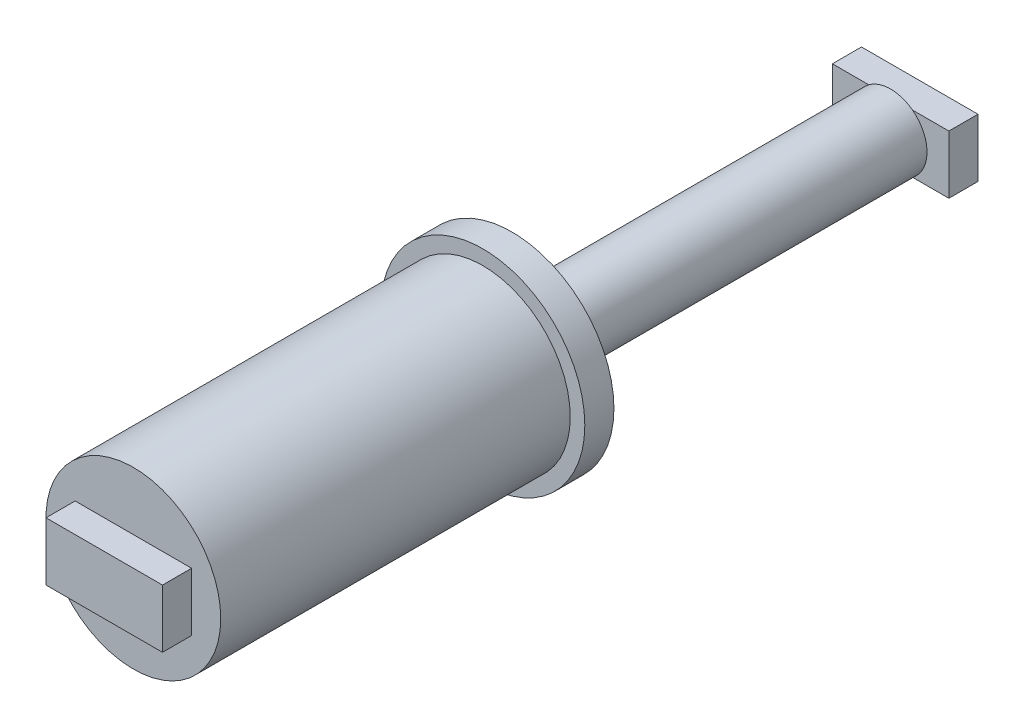
ISO-10303-21;
HEADER;
FILE_DESCRIPTION(('STEP AP214'),'2;1');
FILE_NAME('part.step','',(''),(''),'','','');
FILE_SCHEMA(('AUTOMOTIVE_DESIGN { 1 0 10303 214 1 1 1 1 }'));
ENDSEC;
DATA;
#1=APPLICATION_CONTEXT('core data for automotive mechanical design processes');
#2=APPLICATION_PROTOCOL_DEFINITION('international standard','automotive_design',2000,#1);
#3=PRODUCT_CONTEXT('',#1,'mechanical');
#4=PRODUCT('Part','Part','',(#3));
#5=PRODUCT_RELATED_PRODUCT_CATEGORY('part','',(#4));
#6=PRODUCT_DEFINITION_FORMATION('','',#4);
#7=PRODUCT_DEFINITION_CONTEXT('part definition',#1,'design');
#8=PRODUCT_DEFINITION('design','',#6,#7);
#9=PRODUCT_DEFINITION_SHAPE('','',#8);
#10=(LENGTH_UNIT() NAMED_UNIT(*) SI_UNIT(.MILLI.,.METRE.));
#11=(NAMED_UNIT(*) PLANE_ANGLE_UNIT() SI_UNIT($,.RADIAN.));
#12=(NAMED_UNIT(*) SI_UNIT($,.STERADIAN.) SOLID_ANGLE_UNIT());
#13=UNCERTAINTY_MEASURE_WITH_UNIT(LENGTH_MEASURE(1.E-05),#10,'distance_accuracy_value','');
#14=(GEOMETRIC_REPRESENTATION_CONTEXT(3) GLOBAL_UNCERTAINTY_ASSIGNED_CONTEXT((#13)) GLOBAL_UNIT_ASSIGNED_CONTEXT((#10,
#11,#12)) REPRESENTATION_CONTEXT('',''));
#15=CARTESIAN_POINT('',(0.,0.,0.));
#16=DIRECTION('',(0.,0.,1.));
#17=DIRECTION('',(1.,0.,0.));
#18=AXIS2_PLACEMENT_3D('',#15,#16,#17);
#19=CARTESIAN_POINT('',(0.,0.,0.));
#20=DIRECTION('',(0.,0.,1.));
#21=DIRECTION('',(1.,0.,0.));
#22=AXIS2_PLACEMENT_3D('',#19,#20,#21);
#23=PLANE('',#22);
#24=DIRECTION('',(1.,0.,0.));
#25=VECTOR('',#24,1.);
#26=CARTESIAN_POINT('',(-20.,10.,0.));
#27=LINE('',#26,#25);
#28=CARTESIAN_POINT('',(-7.5,10.,0.));
#29=VERTEX_POINT('',#28);
#30=CARTESIAN_POINT('',(7.5,10.,0.));
#31=VERTEX_POINT('',#30);
#32=EDGE_CURVE('E11',#29,#31,#27,.T.);
#33=ORIENTED_EDGE('',*,*,#32,.F.);
#34=CARTESIAN_POINT('',(0.,0.,0.));
#35=DIRECTION('',(0.,0.,1.));
#36=DIRECTION('',(1.,0.,0.));
#37=AXIS2_PLACEMENT_3D('',#34,#35,#36);
#38=CIRCLE('',#37,12.5);
#39=EDGE_CURVE('E37',#31,#29,#38,.T.);
#40=ORIENTED_EDGE('',*,*,#39,.F.);
#41=EDGE_LOOP('',(#33,#40));
#42=FACE_BOUND('',#41,.T.);
#43=ADVANCED_FACE('F33',(#42),#23,.F.);
#44=DIRECTION('',(-1.,0.,0.));
#45=VECTOR('',#44,1.);
#46=CARTESIAN_POINT('',(-20.,-10.,0.));
#47=LINE('',#46,#45);
#48=CARTESIAN_POINT('',(7.5,-10.,0.));
#49=VERTEX_POINT('',#48);
#50=CARTESIAN_POINT('',(-7.5,-10.,0.));
#51=VERTEX_POINT('',#50);
#52=EDGE_CURVE('E42',#49,#51,#47,.T.);
#53=ORIENTED_EDGE('',*,*,#52,.F.);
#54=EDGE_CURVE('E192',#51,#49,#38,.T.);
#55=ORIENTED_EDGE('',*,*,#54,.F.);
#56=EDGE_LOOP('',(#53,#55));
#57=FACE_BOUND('',#56,.T.);
#58=ADVANCED_FACE('F216',(#57),#23,.F.);
#59=CARTESIAN_POINT('',(0.,0.,140.));
#60=DIRECTION('',(0.,0.,1.));
#61=DIRECTION('',(1.,0.,0.));
#62=AXIS2_PLACEMENT_3D('',#59,#60,#61);
#63=PLANE('',#62);
#64=CARTESIAN_POINT('',(0.,0.,140.));
#65=DIRECTION('',(0.,0.,1.));
#66=DIRECTION('',(1.,0.,0.));
#67=AXIS2_PLACEMENT_3D('',#64,#65,#66);
#68=CIRCLE('',#67,35.);
#69=CARTESIAN_POINT('',(35.,0.,140.));
#70=VERTEX_POINT('',#69);
#71=EDGE_CURVE('E177',#70,#70,#68,.T.);
#72=ORIENTED_EDGE('',*,*,#71,.T.);
#73=EDGE_LOOP('',(#72));
#74=FACE_BOUND('',#73,.T.);
#75=CARTESIAN_POINT('',(0.,0.,140.));
#76=DIRECTION('',(0.,0.,1.));
#77=DIRECTION('',(1.,0.,0.));
#78=AXIS2_PLACEMENT_3D('',#75,#76,#77);
#79=CIRCLE('',#78,30.);
#80=CARTESIAN_POINT('',(30.,0.,140.));
#81=VERTEX_POINT('',#80);
#82=EDGE_CURVE('E170',#81,#81,#79,.T.);
#83=ORIENTED_EDGE('',*,*,#82,.F.);
#84=EDGE_LOOP('',(#83));
#85=FACE_BOUND('',#84,.T.);
#86=ADVANCED_FACE('F220',(#74,#85),#63,.T.);
#87=CARTESIAN_POINT('',(0.,0.,130.));
#88=DIRECTION('',(0.,0.,-1.));
#89=DIRECTION('',(-1.,0.,0.));
#90=AXIS2_PLACEMENT_3D('',#87,#88,#89);
#91=CYLINDRICAL_SURFACE('',#90,12.5);
#92=CARTESIAN_POINT('',(0.,0.,130.));
#93=DIRECTION('',(0.,0.,1.));
#94=DIRECTION('',(1.,0.,0.));
#95=AXIS2_PLACEMENT_3D('',#92,#93,#94);
#96=CIRCLE('',#95,12.5);
#97=CARTESIAN_POINT('',(12.5,0.,130.));
#98=VERTEX_POINT('',#97);
#99=EDGE_CURVE('E182',#98,#98,#96,.T.);
#100=ORIENTED_EDGE('',*,*,#99,.F.);
#101=EDGE_LOOP('',(#100));
#102=FACE_BOUND('',#101,.T.);
#103=ORIENTED_EDGE('',*,*,#39,.T.);
#104=EDGE_CURVE('E188',#29,#51,#38,.T.);
#105=ORIENTED_EDGE('',*,*,#104,.T.);
#106=ORIENTED_EDGE('',*,*,#54,.T.);
#107=EDGE_CURVE('E180',#49,#31,#38,.T.);
#108=ORIENTED_EDGE('',*,*,#107,.T.);
#109=EDGE_LOOP('',(#103,#105,#106,#108));
#110=FACE_BOUND('',#109,.T.);
#111=ADVANCED_FACE('F35',(#102,#110),#91,.T.);
#112=CARTESIAN_POINT('',(0.,0.,130.));
#113=DIRECTION('',(0.,0.,1.));
#114=DIRECTION('',(1.,0.,0.));
#115=AXIS2_PLACEMENT_3D('',#112,#113,#114);
#116=PLANE('',#115);
#117=CARTESIAN_POINT('',(0.,0.,130.));
#118=DIRECTION('',(0.,0.,1.));
#119=DIRECTION('',(1.,0.,0.));
#120=AXIS2_PLACEMENT_3D('',#117,#118,#119);
#121=CIRCLE('',#120,35.);
#122=CARTESIAN_POINT('',(35.,0.,130.));
#123=VERTEX_POINT('',#122);
#124=EDGE_CURVE('E174',#123,#123,#121,.T.);
#125=ORIENTED_EDGE('',*,*,#124,.F.);
#126=EDGE_LOOP('',(#125));
#127=FACE_BOUND('',#126,.T.);
#128=ORIENTED_EDGE('',*,*,#99,.T.);
#129=EDGE_LOOP('',(#128));
#130=FACE_BOUND('',#129,.T.);
#131=ADVANCED_FACE('F226',(#127,#130),#116,.F.);
#132=CARTESIAN_POINT('',(0.,0.,140.));
#133=DIRECTION('',(0.,0.,-1.));
#134=DIRECTION('',(-1.,0.,0.));
#135=AXIS2_PLACEMENT_3D('',#132,#133,#134);
#136=CYLINDRICAL_SURFACE('',#135,35.);
#137=ORIENTED_EDGE('',*,*,#71,.F.);
#138=EDGE_LOOP('',(#137));
#139=FACE_BOUND('',#138,.T.);
#140=ORIENTED_EDGE('',*,*,#124,.T.);
#141=EDGE_LOOP('',(#140));
#142=FACE_BOUND('',#141,.T.);
#143=ADVANCED_FACE('F222',(#139,#142),#136,.T.);
#144=CARTESIAN_POINT('',(0.,0.,260.));
#145=DIRECTION('',(0.,0.,-1.));
#146=DIRECTION('',(-1.,0.,0.));
#147=AXIS2_PLACEMENT_3D('',#144,#145,#146);
#148=CYLINDRICAL_SURFACE('',#147,30.);
#149=CARTESIAN_POINT('',(0.,0.,260.));
#150=DIRECTION('',(0.,0.,1.));
#151=DIRECTION('',(1.,0.,0.));
#152=AXIS2_PLACEMENT_3D('',#149,#150,#151);
#153=CIRCLE('',#152,30.);
#154=CARTESIAN_POINT('',(30.,0.,260.));
#155=VERTEX_POINT('',#154);
#156=EDGE_CURVE('E171',#155,#155,#153,.T.);
#157=ORIENTED_EDGE('',*,*,#156,.F.);
#158=EDGE_LOOP('',(#157));
#159=FACE_BOUND('',#158,.T.);
#160=ORIENTED_EDGE('',*,*,#82,.T.);
#161=EDGE_LOOP('',(#160));
#162=FACE_BOUND('',#161,.T.);
#163=ADVANCED_FACE('F225',(#159,#162),#148,.T.);
#164=CARTESIAN_POINT('',(0.,0.,260.));
#165=DIRECTION('',(0.,0.,1.));
#166=DIRECTION('',(1.,0.,0.));
#167=AXIS2_PLACEMENT_3D('',#164,#165,#166);
#168=PLANE('',#167);
#169=DIRECTION('',(0.,-1.,0.));
#170=VECTOR('',#169,1.);
#171=CARTESIAN_POINT('',(-20.,-10.,260.));
#172=LINE('',#171,#170);
#173=CARTESIAN_POINT('',(-20.,10.,260.));
#174=VERTEX_POINT('',#173);
#175=CARTESIAN_POINT('',(-20.,-10.,260.));
#176=VERTEX_POINT('',#175);
#177=EDGE_CURVE('E52',#174,#176,#172,.T.);
#178=ORIENTED_EDGE('',*,*,#177,.F.);
#179=DIRECTION('',(-1.,0.,0.));
#180=VECTOR('',#179,1.);
#181=CARTESIAN_POINT('',(20.,10.,260.));
#182=LINE('',#181,#180);
#183=CARTESIAN_POINT('',(20.,10.,260.));
#184=VERTEX_POINT('',#183);
#185=EDGE_CURVE('E56',#184,#174,#182,.T.);
#186=ORIENTED_EDGE('',*,*,#185,.F.);
#187=DIRECTION('',(0.,1.,0.));
#188=VECTOR('',#187,1.);
#189=CARTESIAN_POINT('',(20.,-10.,260.));
#190=LINE('',#189,#188);
#191=CARTESIAN_POINT('',(20.,-10.,260.));
#192=VERTEX_POINT('',#191);
#193=EDGE_CURVE('E395',#192,#184,#190,.T.);
#194=ORIENTED_EDGE('',*,*,#193,.F.);
#195=DIRECTION('',(1.,0.,0.));
#196=VECTOR('',#195,1.);
#197=CARTESIAN_POINT('',(20.,-10.,260.));
#198=LINE('',#197,#196);
#199=EDGE_CURVE('E401',#176,#192,#198,.T.);
#200=ORIENTED_EDGE('',*,*,#199,.F.);
#201=EDGE_LOOP('',(#178,#186,#194,#200));
#202=FACE_BOUND('',#201,.T.);
#203=ORIENTED_EDGE('',*,*,#156,.T.);
#204=EDGE_LOOP('',(#203));
#205=FACE_BOUND('',#204,.T.);
#206=ADVANCED_FACE('F236',(#202,#205),#168,.T.);
#207=CARTESIAN_POINT('',(0.,0.,0.));
#208=DIRECTION('',(0.,0.,1.));
#209=DIRECTION('',(1.,0.,0.));
#210=AXIS2_PLACEMENT_3D('',#207,#208,#209);
#211=PLANE('',#210);
#212=ORIENTED_EDGE('',*,*,#104,.F.);
#213=CARTESIAN_POINT('',(-20.,10.,0.));
#214=VERTEX_POINT('',#213);
#215=EDGE_CURVE('E44',#214,#29,#27,.T.);
#216=ORIENTED_EDGE('',*,*,#215,.F.);
#217=DIRECTION('',(0.,1.,0.));
#218=VECTOR('',#217,1.);
#219=CARTESIAN_POINT('',(-20.,10.,0.));
#220=LINE('',#219,#218);
#221=CARTESIAN_POINT('',(-20.,-10.,0.));
#222=VERTEX_POINT('',#221);
#223=EDGE_CURVE('E156',#222,#214,#220,.T.);
#224=ORIENTED_EDGE('',*,*,#223,.F.);
#225=EDGE_CURVE('E137',#51,#222,#47,.T.);
#226=ORIENTED_EDGE('',*,*,#225,.F.);
#227=EDGE_LOOP('',(#212,#216,#224,#226));
#228=FACE_BOUND('',#227,.T.);
#229=ADVANCED_FACE('F240',(#228),#211,.T.);
#230=ORIENTED_EDGE('',*,*,#107,.F.);
#231=CARTESIAN_POINT('',(20.,-10.,0.));
#232=VERTEX_POINT('',#231);
#233=EDGE_CURVE('E153',#232,#49,#47,.T.);
#234=ORIENTED_EDGE('',*,*,#233,.F.);
#235=DIRECTION('',(0.,-1.,0.));
#236=VECTOR('',#235,1.);
#237=CARTESIAN_POINT('',(20.,10.,0.));
#238=LINE('',#237,#236);
#239=CARTESIAN_POINT('',(20.,10.,0.));
#240=VERTEX_POINT('',#239);
#241=EDGE_CURVE('E134',#240,#232,#238,.T.);
#242=ORIENTED_EDGE('',*,*,#241,.F.);
#243=EDGE_CURVE('E45',#31,#240,#27,.T.);
#244=ORIENTED_EDGE('',*,*,#243,.F.);
#245=EDGE_LOOP('',(#230,#234,#242,#244));
#246=FACE_BOUND('',#245,.T.);
#247=ADVANCED_FACE('F200',(#246),#211,.T.);
#248=CARTESIAN_POINT('',(20.,10.,-10.));
#249=DIRECTION('',(-1.,0.,0.));
#250=DIRECTION('',(0.,-1.,0.));
#251=AXIS2_PLACEMENT_3D('',#248,#249,#250);
#252=PLANE('',#251);
#253=ORIENTED_EDGE('',*,*,#241,.T.);
#254=DIRECTION('',(0.,0.,1.));
#255=VECTOR('',#254,1.);
#256=CARTESIAN_POINT('',(20.,-10.,-10.));
#257=LINE('',#256,#255);
#258=CARTESIAN_POINT('',(20.,-10.,-10.));
#259=VERTEX_POINT('',#258);
#260=EDGE_CURVE('E167',#259,#232,#257,.T.);
#261=ORIENTED_EDGE('',*,*,#260,.F.);
#262=DIRECTION('',(0.,-1.,0.));
#263=VECTOR('',#262,1.);
#264=CARTESIAN_POINT('',(20.,10.,-10.));
#265=LINE('',#264,#263);
#266=CARTESIAN_POINT('',(20.,10.,-10.));
#267=VERTEX_POINT('',#266);
#268=EDGE_CURVE('E143',#267,#259,#265,.T.);
#269=ORIENTED_EDGE('',*,*,#268,.F.);
#270=DIRECTION('',(0.,0.,1.));
#271=VECTOR('',#270,1.);
#272=CARTESIAN_POINT('',(20.,10.,-10.));
#273=LINE('',#272,#271);
#274=EDGE_CURVE('E151',#267,#240,#273,.T.);
#275=ORIENTED_EDGE('',*,*,#274,.T.);
#276=EDGE_LOOP('',(#253,#261,#269,#275));
#277=FACE_BOUND('',#276,.T.);
#278=ADVANCED_FACE('F208',(#277),#252,.F.);
#279=CARTESIAN_POINT('',(-20.,-10.,-10.));
#280=DIRECTION('',(0.,1.,0.));
#281=DIRECTION('',(-1.,0.,0.));
#282=AXIS2_PLACEMENT_3D('',#279,#280,#281);
#283=PLANE('',#282);
#284=ORIENTED_EDGE('',*,*,#233,.T.);
#285=ORIENTED_EDGE('',*,*,#52,.T.);
#286=ORIENTED_EDGE('',*,*,#225,.T.);
#287=DIRECTION('',(0.,0.,1.));
#288=VECTOR('',#287,1.);
#289=CARTESIAN_POINT('',(-20.,-10.,-10.));
#290=LINE('',#289,#288);
#291=CARTESIAN_POINT('',(-20.,-10.,-10.));
#292=VERTEX_POINT('',#291);
#293=EDGE_CURVE('E164',#292,#222,#290,.T.);
#294=ORIENTED_EDGE('',*,*,#293,.F.);
#295=DIRECTION('',(-1.,0.,0.));
#296=VECTOR('',#295,1.);
#297=CARTESIAN_POINT('',(-20.,-10.,-10.));
#298=LINE('',#297,#296);
#299=EDGE_CURVE('E146',#259,#292,#298,.T.);
#300=ORIENTED_EDGE('',*,*,#299,.F.);
#301=ORIENTED_EDGE('',*,*,#260,.T.);
#302=EDGE_LOOP('',(#284,#285,#286,#294,#300,#301));
#303=FACE_BOUND('',#302,.T.);
#304=ADVANCED_FACE('F203',(#303),#283,.F.);
#305=CARTESIAN_POINT('',(-20.,10.,-10.));
#306=DIRECTION('',(1.,0.,0.));
#307=DIRECTION('',(0.,1.,0.));
#308=AXIS2_PLACEMENT_3D('',#305,#306,#307);
#309=PLANE('',#308);
#310=ORIENTED_EDGE('',*,*,#223,.T.);
#311=DIRECTION('',(0.,0.,1.));
#312=VECTOR('',#311,1.);
#313=CARTESIAN_POINT('',(-20.,10.,-10.));
#314=LINE('',#313,#312);
#315=CARTESIAN_POINT('',(-20.,10.,-10.));
#316=VERTEX_POINT('',#315);
#317=EDGE_CURVE('E161',#316,#214,#314,.T.);
#318=ORIENTED_EDGE('',*,*,#317,.F.);
#319=DIRECTION('',(0.,1.,0.));
#320=VECTOR('',#319,1.);
#321=CARTESIAN_POINT('',(-20.,10.,-10.));
#322=LINE('',#321,#320);
#323=EDGE_CURVE('E148',#292,#316,#322,.T.);
#324=ORIENTED_EDGE('',*,*,#323,.F.);
#325=ORIENTED_EDGE('',*,*,#293,.T.);
#326=EDGE_LOOP('',(#310,#318,#324,#325));
#327=FACE_BOUND('',#326,.T.);
#328=ADVANCED_FACE('F245',(#327),#309,.F.);
#329=CARTESIAN_POINT('',(-20.,10.,-10.));
#330=DIRECTION('',(0.,-1.,0.));
#331=DIRECTION('',(1.,0.,0.));
#332=AXIS2_PLACEMENT_3D('',#329,#330,#331);
#333=PLANE('',#332);
#334=ORIENTED_EDGE('',*,*,#215,.T.);
#335=ORIENTED_EDGE('',*,*,#32,.T.);
#336=ORIENTED_EDGE('',*,*,#243,.T.);
#337=ORIENTED_EDGE('',*,*,#274,.F.);
#338=DIRECTION('',(1.,0.,0.));
#339=VECTOR('',#338,1.);
#340=CARTESIAN_POINT('',(-20.,10.,-10.));
#341=LINE('',#340,#339);
#342=EDGE_CURVE('E150',#316,#267,#341,.T.);
#343=ORIENTED_EDGE('',*,*,#342,.F.);
#344=ORIENTED_EDGE('',*,*,#317,.T.);
#345=EDGE_LOOP('',(#334,#335,#336,#337,#343,#344));
#346=FACE_BOUND('',#345,.T.);
#347=ADVANCED_FACE('F212',(#346),#333,.F.);
#348=CARTESIAN_POINT('',(0.,0.,-10.));
#349=DIRECTION('',(0.,0.,1.));
#350=DIRECTION('',(1.,0.,0.));
#351=AXIS2_PLACEMENT_3D('',#348,#349,#350);
#352=PLANE('',#351);
#353=ORIENTED_EDGE('',*,*,#268,.T.);
#354=ORIENTED_EDGE('',*,*,#299,.T.);
#355=ORIENTED_EDGE('',*,*,#323,.T.);
#356=ORIENTED_EDGE('',*,*,#342,.T.);
#357=EDGE_LOOP('',(#353,#354,#355,#356));
#358=FACE_BOUND('',#357,.T.);
#359=ADVANCED_FACE('F251',(#358),#352,.F.);
#360=CARTESIAN_POINT('',(-20.,-10.,270.));
#361=DIRECTION('',(1.,0.,0.));
#362=DIRECTION('',(0.,0.,-1.));
#363=AXIS2_PLACEMENT_3D('',#360,#361,#362);
#364=PLANE('',#363);
#365=ORIENTED_EDGE('',*,*,#177,.T.);
#366=DIRECTION('',(0.,0.,-1.));
#367=VECTOR('',#366,1.);
#368=CARTESIAN_POINT('',(-20.,-10.,270.));
#369=LINE('',#368,#367);
#370=CARTESIAN_POINT('',(-20.,-10.,270.));
#371=VERTEX_POINT('',#370);
#372=EDGE_CURVE('E117',#371,#176,#369,.T.);
#373=ORIENTED_EDGE('',*,*,#372,.F.);
#374=DIRECTION('',(0.,-1.,0.));
#375=VECTOR('',#374,1.);
#376=CARTESIAN_POINT('',(-20.,-10.,270.));
#377=LINE('',#376,#375);
#378=CARTESIAN_POINT('',(-20.,10.,270.));
#379=VERTEX_POINT('',#378);
#380=EDGE_CURVE('E123',#379,#371,#377,.T.);
#381=ORIENTED_EDGE('',*,*,#380,.F.);
#382=DIRECTION('',(0.,0.,-1.));
#383=VECTOR('',#382,1.);
#384=CARTESIAN_POINT('',(-20.,10.,270.));
#385=LINE('',#384,#383);
#386=EDGE_CURVE('E393',#379,#174,#385,.T.);
#387=ORIENTED_EDGE('',*,*,#386,.T.);
#388=EDGE_LOOP('',(#365,#373,#381,#387));
#389=FACE_BOUND('',#388,.T.);
#390=ADVANCED_FACE('F133',(#389),#364,.F.);
#391=CARTESIAN_POINT('',(20.,-10.,270.));
#392=DIRECTION('',(0.,1.,0.));
#393=DIRECTION('',(-1.,0.,0.));
#394=AXIS2_PLACEMENT_3D('',#391,#392,#393);
#395=PLANE('',#394);
#396=ORIENTED_EDGE('',*,*,#199,.T.);
#397=DIRECTION('',(0.,0.,-1.));
#398=VECTOR('',#397,1.);
#399=CARTESIAN_POINT('',(20.,-10.,270.));
#400=LINE('',#399,#398);
#401=CARTESIAN_POINT('',(20.,-10.,270.));
#402=VERTEX_POINT('',#401);
#403=EDGE_CURVE('E119',#402,#192,#400,.T.);
#404=ORIENTED_EDGE('',*,*,#403,.F.);
#405=DIRECTION('',(1.,0.,0.));
#406=VECTOR('',#405,1.);
#407=CARTESIAN_POINT('',(20.,-10.,270.));
#408=LINE('',#407,#406);
#409=EDGE_CURVE('E112',#371,#402,#408,.T.);
#410=ORIENTED_EDGE('',*,*,#409,.F.);
#411=ORIENTED_EDGE('',*,*,#372,.T.);
#412=EDGE_LOOP('',(#396,#404,#410,#411));
#413=FACE_BOUND('',#412,.T.);
#414=ADVANCED_FACE('F115',(#413),#395,.F.);
#415=CARTESIAN_POINT('',(20.,-10.,270.));
#416=DIRECTION('',(-1.,0.,0.));
#417=DIRECTION('',(0.,0.,1.));
#418=AXIS2_PLACEMENT_3D('',#415,#416,#417);
#419=PLANE('',#418);
#420=ORIENTED_EDGE('',*,*,#193,.T.);
#421=DIRECTION('',(0.,0.,-1.));
#422=VECTOR('',#421,1.);
#423=CARTESIAN_POINT('',(20.,10.,270.));
#424=LINE('',#423,#422);
#425=CARTESIAN_POINT('',(20.,10.,270.));
#426=VERTEX_POINT('',#425);
#427=EDGE_CURVE('E139',#426,#184,#424,.T.);
#428=ORIENTED_EDGE('',*,*,#427,.F.);
#429=DIRECTION('',(0.,1.,0.));
#430=VECTOR('',#429,1.);
#431=CARTESIAN_POINT('',(20.,-10.,270.));
#432=LINE('',#431,#430);
#433=EDGE_CURVE('E122',#402,#426,#432,.T.);
#434=ORIENTED_EDGE('',*,*,#433,.F.);
#435=ORIENTED_EDGE('',*,*,#403,.T.);
#436=EDGE_LOOP('',(#420,#428,#434,#435));
#437=FACE_BOUND('',#436,.T.);
#438=ADVANCED_FACE('F262',(#437),#419,.F.);
#439=CARTESIAN_POINT('',(20.,10.,270.));
#440=DIRECTION('',(0.,-1.,0.));
#441=DIRECTION('',(1.,0.,0.));
#442=AXIS2_PLACEMENT_3D('',#439,#440,#441);
#443=PLANE('',#442);
#444=ORIENTED_EDGE('',*,*,#185,.T.);
#445=ORIENTED_EDGE('',*,*,#386,.F.);
#446=DIRECTION('',(-1.,0.,0.));
#447=VECTOR('',#446,1.);
#448=CARTESIAN_POINT('',(20.,10.,270.));
#449=LINE('',#448,#447);
#450=EDGE_CURVE('E128',#426,#379,#449,.T.);
#451=ORIENTED_EDGE('',*,*,#450,.F.);
#452=ORIENTED_EDGE('',*,*,#427,.T.);
#453=EDGE_LOOP('',(#444,#445,#451,#452));
#454=FACE_BOUND('',#453,.T.);
#455=ADVANCED_FACE('F265',(#454),#443,.F.);
#456=CARTESIAN_POINT('',(0.,0.,270.));
#457=DIRECTION('',(0.,0.,1.));
#458=DIRECTION('',(1.,0.,0.));
#459=AXIS2_PLACEMENT_3D('',#456,#457,#458);
#460=PLANE('',#459);
#461=ORIENTED_EDGE('',*,*,#380,.T.);
#462=ORIENTED_EDGE('',*,*,#409,.T.);
#463=ORIENTED_EDGE('',*,*,#433,.T.);
#464=ORIENTED_EDGE('',*,*,#450,.T.);
#465=EDGE_LOOP('',(#461,#462,#463,#464));
#466=FACE_BOUND('',#465,.T.);
#467=ADVANCED_FACE('F126',(#466),#460,.T.);
#468=CLOSED_SHELL('',(#43,#58,#86,#111,#131,#143,#163,#206,#229,#247,#278,#304,#328,#347,#359,
#390,#414,#438,#455,#467));
#469=MANIFOLD_SOLID_BREP('B2',#468);
#470=ADVANCED_BREP_SHAPE_REPRESENTATION('',(#18,#469),#14);
#471=SHAPE_DEFINITION_REPRESENTATION(#9,#470);
ENDSEC;
END-ISO-10303-21;
